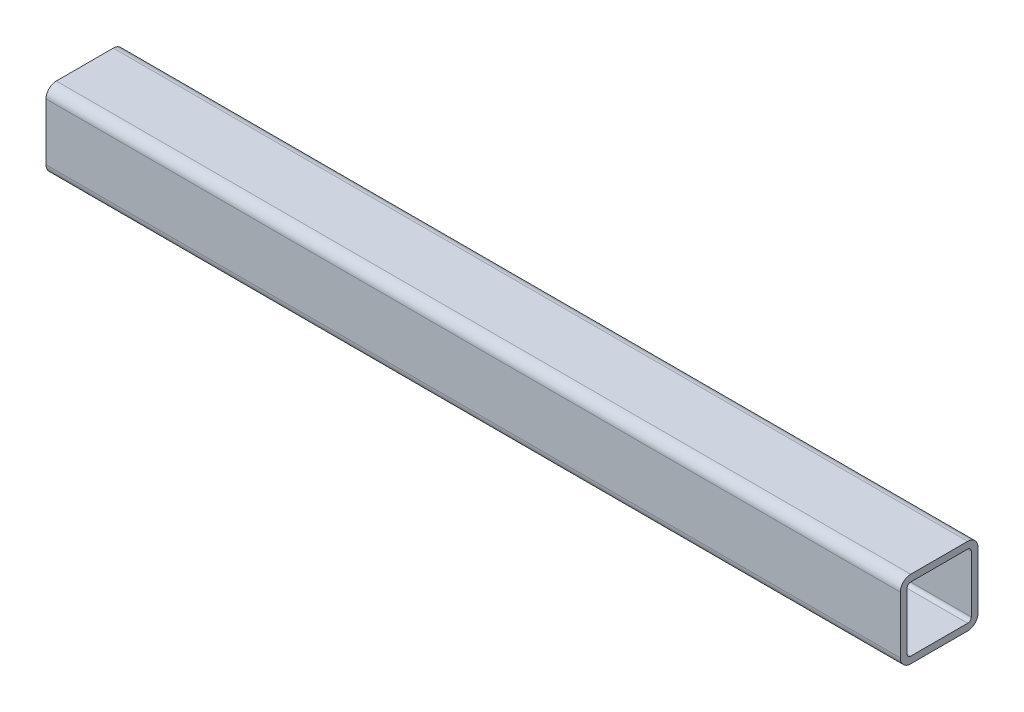
ISO-10303-21;
HEADER;
FILE_DESCRIPTION(('STEP AP214'),'2;1');
FILE_NAME('part.step','',(''),(''),'','','');
FILE_SCHEMA(('AUTOMOTIVE_DESIGN { 1 0 10303 214 1 1 1 1 }'));
ENDSEC;
DATA;
#1=APPLICATION_CONTEXT('core data for automotive mechanical design processes');
#2=APPLICATION_PROTOCOL_DEFINITION('international standard','automotive_design',2000,#1);
#3=PRODUCT_CONTEXT('',#1,'mechanical');
#4=PRODUCT('Part','Part','',(#3));
#5=PRODUCT_RELATED_PRODUCT_CATEGORY('part','',(#4));
#6=PRODUCT_DEFINITION_FORMATION('','',#4);
#7=PRODUCT_DEFINITION_CONTEXT('part definition',#1,'design');
#8=PRODUCT_DEFINITION('design','',#6,#7);
#9=PRODUCT_DEFINITION_SHAPE('','',#8);
#10=(LENGTH_UNIT() NAMED_UNIT(*) SI_UNIT(.MILLI.,.METRE.));
#11=(NAMED_UNIT(*) PLANE_ANGLE_UNIT() SI_UNIT($,.RADIAN.));
#12=(NAMED_UNIT(*) SI_UNIT($,.STERADIAN.) SOLID_ANGLE_UNIT());
#13=UNCERTAINTY_MEASURE_WITH_UNIT(LENGTH_MEASURE(1.E-05),#10,'distance_accuracy_value','');
#14=(GEOMETRIC_REPRESENTATION_CONTEXT(3) GLOBAL_UNCERTAINTY_ASSIGNED_CONTEXT((#13)) GLOBAL_UNIT_ASSIGNED_CONTEXT((#10,
#11,#12)) REPRESENTATION_CONTEXT('',''));
#15=CARTESIAN_POINT('',(0.,0.,0.));
#16=DIRECTION('',(0.,0.,1.));
#17=DIRECTION('',(1.,0.,0.));
#18=AXIS2_PLACEMENT_3D('',#15,#16,#17);
#19=CARTESIAN_POINT('',(209.55,2.54,16.51));
#20=DIRECTION('',(1.,0.,0.));
#21=DIRECTION('',(0.,0.,-1.));
#22=AXIS2_PLACEMENT_3D('',#19,#20,#21);
#23=PLANE('',#22);
#24=CARTESIAN_POINT('',(209.55,2.54,16.51));
#25=DIRECTION('',(1.,0.,0.));
#26=DIRECTION('',(0.,0.,-1.));
#27=AXIS2_PLACEMENT_3D('',#24,#25,#26);
#28=CIRCLE('',#27,2.54);
#29=CARTESIAN_POINT('',(209.55,2.54,19.05));
#30=VERTEX_POINT('',#29);
#31=CARTESIAN_POINT('',(209.55,0.,16.51));
#32=VERTEX_POINT('',#31);
#33=EDGE_CURVE('E251',#30,#32,#28,.T.);
#34=ORIENTED_EDGE('',*,*,#33,.T.);
#35=DIRECTION('',(0.,0.,-1.));
#36=VECTOR('',#35,1.);
#37=CARTESIAN_POINT('',(209.55,0.,16.51));
#38=LINE('',#37,#36);
#39=CARTESIAN_POINT('',(209.55,0.,2.54000000000002));
#40=VERTEX_POINT('',#39);
#41=EDGE_CURVE('E255',#32,#40,#38,.T.);
#42=ORIENTED_EDGE('',*,*,#41,.T.);
#43=CARTESIAN_POINT('',(209.55,2.54,2.54));
#44=DIRECTION('',(1.,0.,0.));
#45=DIRECTION('',(0.,0.,1.));
#46=AXIS2_PLACEMENT_3D('',#43,#44,#45);
#47=CIRCLE('',#46,2.54);
#48=CARTESIAN_POINT('',(209.55,2.54000000000002,0.));
#49=VERTEX_POINT('',#48);
#50=EDGE_CURVE('E259',#40,#49,#47,.T.);
#51=ORIENTED_EDGE('',*,*,#50,.T.);
#52=DIRECTION('',(0.,1.,0.));
#53=VECTOR('',#52,1.);
#54=CARTESIAN_POINT('',(209.55,2.54000000000002,0.));
#55=LINE('',#54,#53);
#56=CARTESIAN_POINT('',(209.55,16.51,0.));
#57=VERTEX_POINT('',#56);
#58=EDGE_CURVE('E262',#49,#57,#55,.T.);
#59=ORIENTED_EDGE('',*,*,#58,.T.);
#60=CARTESIAN_POINT('',(209.55,16.51,2.54));
#61=DIRECTION('',(1.,0.,0.));
#62=DIRECTION('',(0.,0.,-1.));
#63=AXIS2_PLACEMENT_3D('',#60,#61,#62);
#64=CIRCLE('',#63,2.54);
#65=CARTESIAN_POINT('',(209.55,19.05,2.54));
#66=VERTEX_POINT('',#65);
#67=EDGE_CURVE('E265',#57,#66,#64,.T.);
#68=ORIENTED_EDGE('',*,*,#67,.T.);
#69=DIRECTION('',(0.,0.,1.));
#70=VECTOR('',#69,1.);
#71=CARTESIAN_POINT('',(209.55,19.05,2.54));
#72=LINE('',#71,#70);
#73=CARTESIAN_POINT('',(209.55,19.05,16.51));
#74=VERTEX_POINT('',#73);
#75=EDGE_CURVE('E268',#66,#74,#72,.T.);
#76=ORIENTED_EDGE('',*,*,#75,.T.);
#77=CARTESIAN_POINT('',(209.55,16.51,16.51));
#78=DIRECTION('',(1.,0.,0.));
#79=DIRECTION('',(0.,0.,1.));
#80=AXIS2_PLACEMENT_3D('',#77,#78,#79);
#81=CIRCLE('',#80,2.54);
#82=CARTESIAN_POINT('',(209.55,16.51,19.05));
#83=VERTEX_POINT('',#82);
#84=EDGE_CURVE('E271',#74,#83,#81,.T.);
#85=ORIENTED_EDGE('',*,*,#84,.T.);
#86=DIRECTION('',(0.,-1.,0.));
#87=VECTOR('',#86,1.);
#88=CARTESIAN_POINT('',(209.55,16.51,19.05));
#89=LINE('',#88,#87);
#90=EDGE_CURVE('E274',#83,#30,#89,.T.);
#91=ORIENTED_EDGE('',*,*,#90,.T.);
#92=EDGE_LOOP('',(#34,#42,#51,#59,#68,#76,#85,#91));
#93=FACE_BOUND('',#92,.T.);
#94=DIRECTION('',(0.,1.,0.));
#95=VECTOR('',#94,1.);
#96=CARTESIAN_POINT('',(209.55,2.54000000000004,1.651));
#97=LINE('',#96,#95);
#98=CARTESIAN_POINT('',(209.55,2.54000000000004,1.651));
#99=VERTEX_POINT('',#98);
#100=CARTESIAN_POINT('',(209.55,16.51,1.651));
#101=VERTEX_POINT('',#100);
#102=EDGE_CURVE('E170',#99,#101,#97,.T.);
#103=ORIENTED_EDGE('',*,*,#102,.F.);
#104=CARTESIAN_POINT('',(209.55,2.54,2.54));
#105=DIRECTION('',(1.,0.,0.));
#106=DIRECTION('',(0.,0.,1.));
#107=AXIS2_PLACEMENT_3D('',#104,#105,#106);
#108=CIRCLE('',#107,0.889);
#109=CARTESIAN_POINT('',(209.55,1.651,2.54000000000004));
#110=VERTEX_POINT('',#109);
#111=EDGE_CURVE('E161',#110,#99,#108,.T.);
#112=ORIENTED_EDGE('',*,*,#111,.F.);
#113=DIRECTION('',(0.,0.,-1.));
#114=VECTOR('',#113,1.);
#115=CARTESIAN_POINT('',(209.55,1.651,16.51));
#116=LINE('',#115,#114);
#117=CARTESIAN_POINT('',(209.55,1.651,16.51));
#118=VERTEX_POINT('',#117);
#119=EDGE_CURVE('E203',#118,#110,#116,.T.);
#120=ORIENTED_EDGE('',*,*,#119,.F.);
#121=CARTESIAN_POINT('',(209.55,2.54,16.51));
#122=DIRECTION('',(1.,0.,0.));
#123=DIRECTION('',(0.,0.,-1.));
#124=AXIS2_PLACEMENT_3D('',#121,#122,#123);
#125=CIRCLE('',#124,0.889000000000001);
#126=CARTESIAN_POINT('',(209.55,2.54,17.399));
#127=VERTEX_POINT('',#126);
#128=EDGE_CURVE('E200',#127,#118,#125,.T.);
#129=ORIENTED_EDGE('',*,*,#128,.F.);
#130=DIRECTION('',(0.,-1.,0.));
#131=VECTOR('',#130,1.);
#132=CARTESIAN_POINT('',(209.55,16.51,17.399));
#133=LINE('',#132,#131);
#134=CARTESIAN_POINT('',(209.55,16.51,17.399));
#135=VERTEX_POINT('',#134);
#136=EDGE_CURVE('E197',#135,#127,#133,.T.);
#137=ORIENTED_EDGE('',*,*,#136,.F.);
#138=CARTESIAN_POINT('',(209.55,16.51,16.51));
#139=DIRECTION('',(1.,0.,0.));
#140=DIRECTION('',(0.,0.,1.));
#141=AXIS2_PLACEMENT_3D('',#138,#139,#140);
#142=CIRCLE('',#141,0.889000000000001);
#143=CARTESIAN_POINT('',(209.55,17.399,16.51));
#144=VERTEX_POINT('',#143);
#145=EDGE_CURVE('E194',#144,#135,#142,.T.);
#146=ORIENTED_EDGE('',*,*,#145,.F.);
#147=DIRECTION('',(0.,0.,1.));
#148=VECTOR('',#147,1.);
#149=CARTESIAN_POINT('',(209.55,17.399,2.54));
#150=LINE('',#149,#148);
#151=CARTESIAN_POINT('',(209.55,17.399,2.54));
#152=VERTEX_POINT('',#151);
#153=EDGE_CURVE('E189',#152,#144,#150,.T.);
#154=ORIENTED_EDGE('',*,*,#153,.F.);
#155=CARTESIAN_POINT('',(209.55,16.51,2.54));
#156=DIRECTION('',(1.,0.,0.));
#157=DIRECTION('',(0.,0.,-1.));
#158=AXIS2_PLACEMENT_3D('',#155,#156,#157);
#159=CIRCLE('',#158,0.889000000000001);
#160=EDGE_CURVE('E184',#101,#152,#159,.T.);
#161=ORIENTED_EDGE('',*,*,#160,.F.);
#162=EDGE_LOOP('',(#103,#112,#120,#129,#137,#146,#154,#161));
#163=FACE_BOUND('',#162,.T.);
#164=ADVANCED_FACE('F47',(#93,#163),#23,.T.);
#165=CARTESIAN_POINT('',(0.,2.54,16.51));
#166=DIRECTION('',(1.,0.,0.));
#167=DIRECTION('',(0.,0.,-1.));
#168=AXIS2_PLACEMENT_3D('',#165,#166,#167);
#169=PLANE('',#168);
#170=CARTESIAN_POINT('',(0.,2.54,16.51));
#171=DIRECTION('',(1.,0.,0.));
#172=DIRECTION('',(0.,0.,-1.));
#173=AXIS2_PLACEMENT_3D('',#170,#171,#172);
#174=CIRCLE('',#173,2.54);
#175=CARTESIAN_POINT('',(0.,2.54,19.05));
#176=VERTEX_POINT('',#175);
#177=CARTESIAN_POINT('',(0.,0.,16.51));
#178=VERTEX_POINT('',#177);
#179=EDGE_CURVE('E179',#176,#178,#174,.T.);
#180=ORIENTED_EDGE('',*,*,#179,.F.);
#181=DIRECTION('',(0.,-1.,0.));
#182=VECTOR('',#181,1.);
#183=CARTESIAN_POINT('',(0.,16.51,19.05));
#184=LINE('',#183,#182);
#185=CARTESIAN_POINT('',(0.,16.51,19.05));
#186=VERTEX_POINT('',#185);
#187=EDGE_CURVE('E256',#186,#176,#184,.T.);
#188=ORIENTED_EDGE('',*,*,#187,.F.);
#189=CARTESIAN_POINT('',(0.,16.51,16.51));
#190=DIRECTION('',(1.,0.,0.));
#191=DIRECTION('',(0.,0.,1.));
#192=AXIS2_PLACEMENT_3D('',#189,#190,#191);
#193=CIRCLE('',#192,2.54);
#194=CARTESIAN_POINT('',(0.,19.05,16.51));
#195=VERTEX_POINT('',#194);
#196=EDGE_CURVE('E296',#195,#186,#193,.T.);
#197=ORIENTED_EDGE('',*,*,#196,.F.);
#198=DIRECTION('',(0.,0.,1.));
#199=VECTOR('',#198,1.);
#200=CARTESIAN_POINT('',(0.,19.05,2.54));
#201=LINE('',#200,#199);
#202=CARTESIAN_POINT('',(0.,19.05,2.54));
#203=VERTEX_POINT('',#202);
#204=EDGE_CURVE('E293',#203,#195,#201,.T.);
#205=ORIENTED_EDGE('',*,*,#204,.F.);
#206=CARTESIAN_POINT('',(0.,16.51,2.54));
#207=DIRECTION('',(1.,0.,0.));
#208=DIRECTION('',(0.,0.,-1.));
#209=AXIS2_PLACEMENT_3D('',#206,#207,#208);
#210=CIRCLE('',#209,2.54);
#211=CARTESIAN_POINT('',(0.,16.51,0.));
#212=VERTEX_POINT('',#211);
#213=EDGE_CURVE('E290',#212,#203,#210,.T.);
#214=ORIENTED_EDGE('',*,*,#213,.F.);
#215=DIRECTION('',(0.,1.,0.));
#216=VECTOR('',#215,1.);
#217=CARTESIAN_POINT('',(0.,2.54000000000002,0.));
#218=LINE('',#217,#216);
#219=CARTESIAN_POINT('',(0.,2.54000000000002,0.));
#220=VERTEX_POINT('',#219);
#221=EDGE_CURVE('E287',#220,#212,#218,.T.);
#222=ORIENTED_EDGE('',*,*,#221,.F.);
#223=CARTESIAN_POINT('',(0.,2.54,2.54));
#224=DIRECTION('',(1.,0.,0.));
#225=DIRECTION('',(0.,0.,1.));
#226=AXIS2_PLACEMENT_3D('',#223,#224,#225);
#227=CIRCLE('',#226,2.54);
#228=CARTESIAN_POINT('',(0.,0.,2.54000000000002));
#229=VERTEX_POINT('',#228);
#230=EDGE_CURVE('E284',#229,#220,#227,.T.);
#231=ORIENTED_EDGE('',*,*,#230,.F.);
#232=DIRECTION('',(0.,0.,-1.));
#233=VECTOR('',#232,1.);
#234=CARTESIAN_POINT('',(0.,0.,16.51));
#235=LINE('',#234,#233);
#236=EDGE_CURVE('E281',#178,#229,#235,.T.);
#237=ORIENTED_EDGE('',*,*,#236,.F.);
#238=EDGE_LOOP('',(#180,#188,#197,#205,#214,#222,#231,#237));
#239=FACE_BOUND('',#238,.T.);
#240=CARTESIAN_POINT('',(0.,2.54,2.54));
#241=DIRECTION('',(1.,0.,0.));
#242=DIRECTION('',(0.,0.,1.));
#243=AXIS2_PLACEMENT_3D('',#240,#241,#242);
#244=CIRCLE('',#243,0.889);
#245=CARTESIAN_POINT('',(0.,1.651,2.54000000000004));
#246=VERTEX_POINT('',#245);
#247=CARTESIAN_POINT('',(0.,2.54000000000004,1.651));
#248=VERTEX_POINT('',#247);
#249=EDGE_CURVE('E71',#246,#248,#244,.T.);
#250=ORIENTED_EDGE('',*,*,#249,.T.);
#251=DIRECTION('',(0.,1.,0.));
#252=VECTOR('',#251,1.);
#253=CARTESIAN_POINT('',(0.,2.54000000000004,1.651));
#254=LINE('',#253,#252);
#255=CARTESIAN_POINT('',(0.,16.51,1.651));
#256=VERTEX_POINT('',#255);
#257=EDGE_CURVE('E177',#248,#256,#254,.T.);
#258=ORIENTED_EDGE('',*,*,#257,.T.);
#259=CARTESIAN_POINT('',(0.,16.51,2.54));
#260=DIRECTION('',(1.,0.,0.));
#261=DIRECTION('',(0.,0.,-1.));
#262=AXIS2_PLACEMENT_3D('',#259,#260,#261);
#263=CIRCLE('',#262,0.889000000000001);
#264=CARTESIAN_POINT('',(0.,17.399,2.54));
#265=VERTEX_POINT('',#264);
#266=EDGE_CURVE('E210',#256,#265,#263,.T.);
#267=ORIENTED_EDGE('',*,*,#266,.T.);
#268=DIRECTION('',(0.,0.,1.));
#269=VECTOR('',#268,1.);
#270=CARTESIAN_POINT('',(0.,17.399,2.54));
#271=LINE('',#270,#269);
#272=CARTESIAN_POINT('',(0.,17.399,16.51));
#273=VERTEX_POINT('',#272);
#274=EDGE_CURVE('E214',#265,#273,#271,.T.);
#275=ORIENTED_EDGE('',*,*,#274,.T.);
#276=CARTESIAN_POINT('',(0.,16.51,16.51));
#277=DIRECTION('',(1.,0.,0.));
#278=DIRECTION('',(0.,0.,1.));
#279=AXIS2_PLACEMENT_3D('',#276,#277,#278);
#280=CIRCLE('',#279,0.889000000000001);
#281=CARTESIAN_POINT('',(0.,16.51,17.399));
#282=VERTEX_POINT('',#281);
#283=EDGE_CURVE('E218',#273,#282,#280,.T.);
#284=ORIENTED_EDGE('',*,*,#283,.T.);
#285=DIRECTION('',(0.,-1.,0.));
#286=VECTOR('',#285,1.);
#287=CARTESIAN_POINT('',(0.,16.51,17.399));
#288=LINE('',#287,#286);
#289=CARTESIAN_POINT('',(0.,2.54,17.399));
#290=VERTEX_POINT('',#289);
#291=EDGE_CURVE('E222',#282,#290,#288,.T.);
#292=ORIENTED_EDGE('',*,*,#291,.T.);
#293=CARTESIAN_POINT('',(0.,2.54,16.51));
#294=DIRECTION('',(1.,0.,0.));
#295=DIRECTION('',(0.,0.,-1.));
#296=AXIS2_PLACEMENT_3D('',#293,#294,#295);
#297=CIRCLE('',#296,0.889000000000001);
#298=CARTESIAN_POINT('',(0.,1.651,16.51));
#299=VERTEX_POINT('',#298);
#300=EDGE_CURVE('E226',#290,#299,#297,.T.);
#301=ORIENTED_EDGE('',*,*,#300,.T.);
#302=DIRECTION('',(0.,0.,-1.));
#303=VECTOR('',#302,1.);
#304=CARTESIAN_POINT('',(0.,1.651,16.51));
#305=LINE('',#304,#303);
#306=EDGE_CURVE('E171',#299,#246,#305,.T.);
#307=ORIENTED_EDGE('',*,*,#306,.T.);
#308=EDGE_LOOP('',(#250,#258,#267,#275,#284,#292,#301,#307));
#309=FACE_BOUND('',#308,.T.);
#310=ADVANCED_FACE('F336',(#239,#309),#169,.F.);
#311=CARTESIAN_POINT('',(209.55,2.54,16.51));
#312=DIRECTION('',(-1.,0.,0.));
#313=DIRECTION('',(0.,0.,1.));
#314=AXIS2_PLACEMENT_3D('',#311,#312,#313);
#315=CYLINDRICAL_SURFACE('',#314,2.54);
#316=ORIENTED_EDGE('',*,*,#179,.T.);
#317=DIRECTION('',(-1.,0.,0.));
#318=VECTOR('',#317,1.);
#319=CARTESIAN_POINT('',(209.55,0.,16.51));
#320=LINE('',#319,#318);
#321=EDGE_CURVE('E11',#32,#178,#320,.T.);
#322=ORIENTED_EDGE('',*,*,#321,.F.);
#323=ORIENTED_EDGE('',*,*,#33,.F.);
#324=DIRECTION('',(-1.,0.,0.));
#325=VECTOR('',#324,1.);
#326=CARTESIAN_POINT('',(209.55,2.54,19.05));
#327=LINE('',#326,#325);
#328=EDGE_CURVE('E277',#30,#176,#327,.T.);
#329=ORIENTED_EDGE('',*,*,#328,.T.);
#330=EDGE_LOOP('',(#316,#322,#323,#329));
#331=FACE_BOUND('',#330,.T.);
#332=ADVANCED_FACE('F49',(#331),#315,.T.);
#333=CARTESIAN_POINT('',(209.55,0.,16.51));
#334=DIRECTION('',(0.,1.,0.));
#335=DIRECTION('',(0.,0.,1.));
#336=AXIS2_PLACEMENT_3D('',#333,#334,#335);
#337=PLANE('',#336);
#338=ORIENTED_EDGE('',*,*,#236,.T.);
#339=DIRECTION('',(-1.,0.,0.));
#340=VECTOR('',#339,1.);
#341=CARTESIAN_POINT('',(209.55,0.,2.54000000000002));
#342=LINE('',#341,#340);
#343=EDGE_CURVE('E56',#40,#229,#342,.T.);
#344=ORIENTED_EDGE('',*,*,#343,.F.);
#345=ORIENTED_EDGE('',*,*,#41,.F.);
#346=ORIENTED_EDGE('',*,*,#321,.T.);
#347=EDGE_LOOP('',(#338,#344,#345,#346));
#348=FACE_BOUND('',#347,.T.);
#349=ADVANCED_FACE('F353',(#348),#337,.F.);
#350=CARTESIAN_POINT('',(209.55,2.54,2.54));
#351=DIRECTION('',(-1.,0.,0.));
#352=DIRECTION('',(0.,0.,1.));
#353=AXIS2_PLACEMENT_3D('',#350,#351,#352);
#354=CYLINDRICAL_SURFACE('',#353,2.54);
#355=ORIENTED_EDGE('',*,*,#230,.T.);
#356=DIRECTION('',(-1.,0.,0.));
#357=VECTOR('',#356,1.);
#358=CARTESIAN_POINT('',(209.55,2.54000000000002,0.));
#359=LINE('',#358,#357);
#360=EDGE_CURVE('E320',#49,#220,#359,.T.);
#361=ORIENTED_EDGE('',*,*,#360,.F.);
#362=ORIENTED_EDGE('',*,*,#50,.F.);
#363=ORIENTED_EDGE('',*,*,#343,.T.);
#364=EDGE_LOOP('',(#355,#361,#362,#363));
#365=FACE_BOUND('',#364,.T.);
#366=ADVANCED_FACE('F330',(#365),#354,.T.);
#367=CARTESIAN_POINT('',(209.55,2.54000000000002,0.));
#368=DIRECTION('',(0.,0.,1.));
#369=DIRECTION('',(1.,0.,0.));
#370=AXIS2_PLACEMENT_3D('',#367,#368,#369);
#371=PLANE('',#370);
#372=ORIENTED_EDGE('',*,*,#221,.T.);
#373=DIRECTION('',(-1.,0.,0.));
#374=VECTOR('',#373,1.);
#375=CARTESIAN_POINT('',(209.55,16.51,0.));
#376=LINE('',#375,#374);
#377=EDGE_CURVE('E316',#57,#212,#376,.T.);
#378=ORIENTED_EDGE('',*,*,#377,.F.);
#379=ORIENTED_EDGE('',*,*,#58,.F.);
#380=ORIENTED_EDGE('',*,*,#360,.T.);
#381=EDGE_LOOP('',(#372,#378,#379,#380));
#382=FACE_BOUND('',#381,.T.);
#383=ADVANCED_FACE('F342',(#382),#371,.F.);
#384=CARTESIAN_POINT('',(209.55,16.51,2.54));
#385=DIRECTION('',(-1.,0.,0.));
#386=DIRECTION('',(0.,0.,1.));
#387=AXIS2_PLACEMENT_3D('',#384,#385,#386);
#388=CYLINDRICAL_SURFACE('',#387,2.54);
#389=ORIENTED_EDGE('',*,*,#213,.T.);
#390=DIRECTION('',(-1.,0.,0.));
#391=VECTOR('',#390,1.);
#392=CARTESIAN_POINT('',(209.55,19.05,2.54));
#393=LINE('',#392,#391);
#394=EDGE_CURVE('E312',#66,#203,#393,.T.);
#395=ORIENTED_EDGE('',*,*,#394,.F.);
#396=ORIENTED_EDGE('',*,*,#67,.F.);
#397=ORIENTED_EDGE('',*,*,#377,.T.);
#398=EDGE_LOOP('',(#389,#395,#396,#397));
#399=FACE_BOUND('',#398,.T.);
#400=ADVANCED_FACE('F346',(#399),#388,.T.);
#401=CARTESIAN_POINT('',(209.55,19.05,2.54));
#402=DIRECTION('',(0.,-1.,0.));
#403=DIRECTION('',(0.,0.,-1.));
#404=AXIS2_PLACEMENT_3D('',#401,#402,#403);
#405=PLANE('',#404);
#406=ORIENTED_EDGE('',*,*,#204,.T.);
#407=DIRECTION('',(-1.,0.,0.));
#408=VECTOR('',#407,1.);
#409=CARTESIAN_POINT('',(209.55,19.05,16.51));
#410=LINE('',#409,#408);
#411=EDGE_CURVE('E308',#74,#195,#410,.T.);
#412=ORIENTED_EDGE('',*,*,#411,.F.);
#413=ORIENTED_EDGE('',*,*,#75,.F.);
#414=ORIENTED_EDGE('',*,*,#394,.T.);
#415=EDGE_LOOP('',(#406,#412,#413,#414));
#416=FACE_BOUND('',#415,.T.);
#417=ADVANCED_FACE('F366',(#416),#405,.F.);
#418=CARTESIAN_POINT('',(209.55,16.51,16.51));
#419=DIRECTION('',(-1.,0.,0.));
#420=DIRECTION('',(0.,0.,1.));
#421=AXIS2_PLACEMENT_3D('',#418,#419,#420);
#422=CYLINDRICAL_SURFACE('',#421,2.54);
#423=ORIENTED_EDGE('',*,*,#196,.T.);
#424=DIRECTION('',(-1.,0.,0.));
#425=VECTOR('',#424,1.);
#426=CARTESIAN_POINT('',(209.55,16.51,19.05));
#427=LINE('',#426,#425);
#428=EDGE_CURVE('E304',#83,#186,#427,.T.);
#429=ORIENTED_EDGE('',*,*,#428,.F.);
#430=ORIENTED_EDGE('',*,*,#84,.F.);
#431=ORIENTED_EDGE('',*,*,#411,.T.);
#432=EDGE_LOOP('',(#423,#429,#430,#431));
#433=FACE_BOUND('',#432,.T.);
#434=ADVANCED_FACE('F364',(#433),#422,.T.);
#435=CARTESIAN_POINT('',(209.55,16.51,19.05));
#436=DIRECTION('',(0.,0.,-1.));
#437=DIRECTION('',(0.,1.,0.));
#438=AXIS2_PLACEMENT_3D('',#435,#436,#437);
#439=PLANE('',#438);
#440=ORIENTED_EDGE('',*,*,#187,.T.);
#441=ORIENTED_EDGE('',*,*,#328,.F.);
#442=ORIENTED_EDGE('',*,*,#90,.F.);
#443=ORIENTED_EDGE('',*,*,#428,.T.);
#444=EDGE_LOOP('',(#440,#441,#442,#443));
#445=FACE_BOUND('',#444,.T.);
#446=ADVANCED_FACE('F359',(#445),#439,.F.);
#447=CARTESIAN_POINT('',(209.55,2.54,2.54));
#448=DIRECTION('',(-1.,0.,0.));
#449=DIRECTION('',(0.,0.,1.));
#450=AXIS2_PLACEMENT_3D('',#447,#448,#449);
#451=CYLINDRICAL_SURFACE('',#450,0.889);
#452=ORIENTED_EDGE('',*,*,#249,.F.);
#453=DIRECTION('',(-1.,0.,0.));
#454=VECTOR('',#453,1.);
#455=CARTESIAN_POINT('',(209.55,1.651,2.54000000000004));
#456=LINE('',#455,#454);
#457=EDGE_CURVE('E165',#110,#246,#456,.T.);
#458=ORIENTED_EDGE('',*,*,#457,.F.);
#459=ORIENTED_EDGE('',*,*,#111,.T.);
#460=DIRECTION('',(-1.,0.,0.));
#461=VECTOR('',#460,1.);
#462=CARTESIAN_POINT('',(209.55,2.54000000000004,1.651));
#463=LINE('',#462,#461);
#464=EDGE_CURVE('E164',#99,#248,#463,.T.);
#465=ORIENTED_EDGE('',*,*,#464,.T.);
#466=EDGE_LOOP('',(#452,#458,#459,#465));
#467=FACE_BOUND('',#466,.T.);
#468=ADVANCED_FACE('F163',(#467),#451,.F.);
#469=CARTESIAN_POINT('',(209.55,2.54000000000004,1.651));
#470=DIRECTION('',(0.,0.,1.));
#471=DIRECTION('',(1.,0.,0.));
#472=AXIS2_PLACEMENT_3D('',#469,#470,#471);
#473=PLANE('',#472);
#474=ORIENTED_EDGE('',*,*,#257,.F.);
#475=ORIENTED_EDGE('',*,*,#464,.F.);
#476=ORIENTED_EDGE('',*,*,#102,.T.);
#477=DIRECTION('',(-1.,0.,0.));
#478=VECTOR('',#477,1.);
#479=CARTESIAN_POINT('',(209.55,16.51,1.651));
#480=LINE('',#479,#478);
#481=EDGE_CURVE('E180',#101,#256,#480,.T.);
#482=ORIENTED_EDGE('',*,*,#481,.T.);
#483=EDGE_LOOP('',(#474,#475,#476,#482));
#484=FACE_BOUND('',#483,.T.);
#485=ADVANCED_FACE('F174',(#484),#473,.T.);
#486=CARTESIAN_POINT('',(209.55,16.51,2.54));
#487=DIRECTION('',(-1.,0.,0.));
#488=DIRECTION('',(0.,0.,1.));
#489=AXIS2_PLACEMENT_3D('',#486,#487,#488);
#490=CYLINDRICAL_SURFACE('',#489,0.889000000000001);
#491=ORIENTED_EDGE('',*,*,#266,.F.);
#492=ORIENTED_EDGE('',*,*,#481,.F.);
#493=ORIENTED_EDGE('',*,*,#160,.T.);
#494=DIRECTION('',(-1.,0.,0.));
#495=VECTOR('',#494,1.);
#496=CARTESIAN_POINT('',(209.55,17.399,2.54));
#497=LINE('',#496,#495);
#498=EDGE_CURVE('E246',#152,#265,#497,.T.);
#499=ORIENTED_EDGE('',*,*,#498,.T.);
#500=EDGE_LOOP('',(#491,#492,#493,#499));
#501=FACE_BOUND('',#500,.T.);
#502=ADVANCED_FACE('F391',(#501),#490,.F.);
#503=CARTESIAN_POINT('',(209.55,17.399,2.54));
#504=DIRECTION('',(0.,-1.,0.));
#505=DIRECTION('',(0.,0.,-1.));
#506=AXIS2_PLACEMENT_3D('',#503,#504,#505);
#507=PLANE('',#506);
#508=ORIENTED_EDGE('',*,*,#274,.F.);
#509=ORIENTED_EDGE('',*,*,#498,.F.);
#510=ORIENTED_EDGE('',*,*,#153,.T.);
#511=DIRECTION('',(-1.,0.,0.));
#512=VECTOR('',#511,1.);
#513=CARTESIAN_POINT('',(209.55,17.399,16.51));
#514=LINE('',#513,#512);
#515=EDGE_CURVE('E243',#144,#273,#514,.T.);
#516=ORIENTED_EDGE('',*,*,#515,.T.);
#517=EDGE_LOOP('',(#508,#509,#510,#516));
#518=FACE_BOUND('',#517,.T.);
#519=ADVANCED_FACE('F395',(#518),#507,.T.);
#520=CARTESIAN_POINT('',(209.55,16.51,16.51));
#521=DIRECTION('',(-1.,0.,0.));
#522=DIRECTION('',(0.,0.,1.));
#523=AXIS2_PLACEMENT_3D('',#520,#521,#522);
#524=CYLINDRICAL_SURFACE('',#523,0.889000000000001);
#525=ORIENTED_EDGE('',*,*,#283,.F.);
#526=ORIENTED_EDGE('',*,*,#515,.F.);
#527=ORIENTED_EDGE('',*,*,#145,.T.);
#528=DIRECTION('',(-1.,0.,0.));
#529=VECTOR('',#528,1.);
#530=CARTESIAN_POINT('',(209.55,16.51,17.399));
#531=LINE('',#530,#529);
#532=EDGE_CURVE('E240',#135,#282,#531,.T.);
#533=ORIENTED_EDGE('',*,*,#532,.T.);
#534=EDGE_LOOP('',(#525,#526,#527,#533));
#535=FACE_BOUND('',#534,.T.);
#536=ADVANCED_FACE('F401',(#535),#524,.F.);
#537=CARTESIAN_POINT('',(209.55,16.51,17.399));
#538=DIRECTION('',(0.,0.,-1.));
#539=DIRECTION('',(-1.,0.,0.));
#540=AXIS2_PLACEMENT_3D('',#537,#538,#539);
#541=PLANE('',#540);
#542=ORIENTED_EDGE('',*,*,#291,.F.);
#543=ORIENTED_EDGE('',*,*,#532,.F.);
#544=ORIENTED_EDGE('',*,*,#136,.T.);
#545=DIRECTION('',(-1.,0.,0.));
#546=VECTOR('',#545,1.);
#547=CARTESIAN_POINT('',(209.55,2.54,17.399));
#548=LINE('',#547,#546);
#549=EDGE_CURVE('E237',#127,#290,#548,.T.);
#550=ORIENTED_EDGE('',*,*,#549,.T.);
#551=EDGE_LOOP('',(#542,#543,#544,#550));
#552=FACE_BOUND('',#551,.T.);
#553=ADVANCED_FACE('F405',(#552),#541,.T.);
#554=CARTESIAN_POINT('',(209.55,2.54,16.51));
#555=DIRECTION('',(-1.,0.,0.));
#556=DIRECTION('',(0.,0.,1.));
#557=AXIS2_PLACEMENT_3D('',#554,#555,#556);
#558=CYLINDRICAL_SURFACE('',#557,0.889000000000001);
#559=ORIENTED_EDGE('',*,*,#300,.F.);
#560=ORIENTED_EDGE('',*,*,#549,.F.);
#561=ORIENTED_EDGE('',*,*,#128,.T.);
#562=DIRECTION('',(-1.,0.,0.));
#563=VECTOR('',#562,1.);
#564=CARTESIAN_POINT('',(209.55,1.651,16.51));
#565=LINE('',#564,#563);
#566=EDGE_CURVE('E63',#118,#299,#565,.T.);
#567=ORIENTED_EDGE('',*,*,#566,.T.);
#568=EDGE_LOOP('',(#559,#560,#561,#567));
#569=FACE_BOUND('',#568,.T.);
#570=ADVANCED_FACE('F409',(#569),#558,.F.);
#571=CARTESIAN_POINT('',(209.55,1.651,16.51));
#572=DIRECTION('',(0.,1.,0.));
#573=DIRECTION('',(0.,0.,1.));
#574=AXIS2_PLACEMENT_3D('',#571,#572,#573);
#575=PLANE('',#574);
#576=ORIENTED_EDGE('',*,*,#306,.F.);
#577=ORIENTED_EDGE('',*,*,#566,.F.);
#578=ORIENTED_EDGE('',*,*,#119,.T.);
#579=ORIENTED_EDGE('',*,*,#457,.T.);
#580=EDGE_LOOP('',(#576,#577,#578,#579));
#581=FACE_BOUND('',#580,.T.);
#582=ADVANCED_FACE('F413',(#581),#575,.T.);
#583=CLOSED_SHELL('',(#164,#310,#332,#349,#366,#383,#400,#417,#434,#446,#468,#485,#502,#519,
#536,#553,#570,#582));
#584=MANIFOLD_SOLID_BREP('B2',#583);
#585=ADVANCED_BREP_SHAPE_REPRESENTATION('',(#18,#584),#14);
#586=SHAPE_DEFINITION_REPRESENTATION(#9,#585);
ENDSEC;
END-ISO-10303-21;
